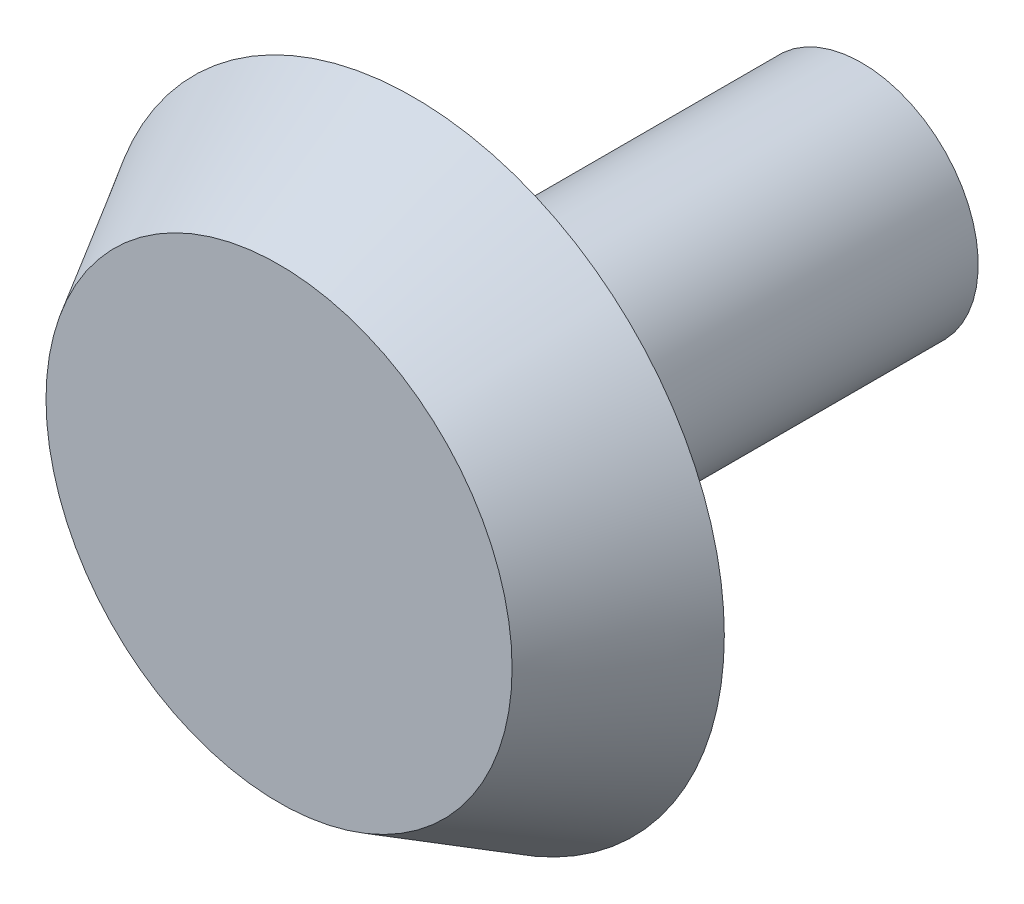
ISO-10303-21;
HEADER;
FILE_DESCRIPTION(('STEP AP214'),'2;1');
FILE_NAME('part.step','',(''),(''),'','','');
FILE_SCHEMA(('AUTOMOTIVE_DESIGN { 1 0 10303 214 1 1 1 1 }'));
ENDSEC;
DATA;
#1=APPLICATION_CONTEXT('core data for automotive mechanical design processes');
#2=APPLICATION_PROTOCOL_DEFINITION('international standard','automotive_design',2000,#1);
#3=PRODUCT_CONTEXT('',#1,'mechanical');
#4=PRODUCT('Part','Part','',(#3));
#5=PRODUCT_RELATED_PRODUCT_CATEGORY('part','',(#4));
#6=PRODUCT_DEFINITION_FORMATION('','',#4);
#7=PRODUCT_DEFINITION_CONTEXT('part definition',#1,'design');
#8=PRODUCT_DEFINITION('design','',#6,#7);
#9=PRODUCT_DEFINITION_SHAPE('','',#8);
#10=(LENGTH_UNIT() NAMED_UNIT(*) SI_UNIT(.MILLI.,.METRE.));
#11=(NAMED_UNIT(*) PLANE_ANGLE_UNIT() SI_UNIT($,.RADIAN.));
#12=(NAMED_UNIT(*) SI_UNIT($,.STERADIAN.) SOLID_ANGLE_UNIT());
#13=UNCERTAINTY_MEASURE_WITH_UNIT(LENGTH_MEASURE(1.E-05),#10,'distance_accuracy_value','');
#14=(GEOMETRIC_REPRESENTATION_CONTEXT(3) GLOBAL_UNCERTAINTY_ASSIGNED_CONTEXT((#13)) GLOBAL_UNIT_ASSIGNED_CONTEXT((#10,
#11,#12)) REPRESENTATION_CONTEXT('',''));
#15=CARTESIAN_POINT('',(0.,0.,0.));
#16=DIRECTION('',(0.,0.,1.));
#17=DIRECTION('',(1.,0.,0.));
#18=AXIS2_PLACEMENT_3D('',#15,#16,#17);
#19=CARTESIAN_POINT('',(0.,0.,-75.));
#20=DIRECTION('',(0.,0.,1.));
#21=DIRECTION('',(1.,0.,0.));
#22=AXIS2_PLACEMENT_3D('',#19,#20,#21);
#23=PLANE('',#22);
#24=CARTESIAN_POINT('',(0.,0.,-75.));
#25=DIRECTION('',(0.,0.,-1.));
#26=DIRECTION('',(-1.,0.,0.));
#27=AXIS2_PLACEMENT_3D('',#24,#25,#26);
#28=CIRCLE('',#27,15.);
#29=CARTESIAN_POINT('',(-15.,0.,-75.));
#30=VERTEX_POINT('',#29);
#31=EDGE_CURVE('E10',#30,#30,#28,.T.);
#32=ORIENTED_EDGE('',*,*,#31,.T.);
#33=EDGE_LOOP('',(#32));
#34=FACE_BOUND('',#33,.T.);
#35=ADVANCED_FACE('F37',(#34),#23,.F.);
#36=CARTESIAN_POINT('',(0.,0.,-75.));
#37=DIRECTION('',(0.,0.,-1.));
#38=DIRECTION('',(-1.,0.,0.));
#39=AXIS2_PLACEMENT_3D('',#36,#37,#38);
#40=CYLINDRICAL_SURFACE('',#39,15.);
#41=ORIENTED_EDGE('',*,*,#31,.F.);
#42=EDGE_LOOP('',(#41));
#43=FACE_BOUND('',#42,.T.);
#44=CARTESIAN_POINT('',(0.,0.,-9.99999999999999));
#45=DIRECTION('',(0.,0.,-1.));
#46=DIRECTION('',(-1.,0.,0.));
#47=AXIS2_PLACEMENT_3D('',#44,#45,#46);
#48=CIRCLE('',#47,15.);
#49=CARTESIAN_POINT('',(-15.,0.,-9.99999999999999));
#50=VERTEX_POINT('',#49);
#51=EDGE_CURVE('E44',#50,#50,#48,.T.);
#52=ORIENTED_EDGE('',*,*,#51,.T.);
#53=EDGE_LOOP('',(#52));
#54=FACE_BOUND('',#53,.T.);
#55=ADVANCED_FACE('F77',(#43,#54),#40,.T.);
#56=CARTESIAN_POINT('',(15.,0.,-10.));
#57=DIRECTION('',(0.,0.,1.));
#58=DIRECTION('',(1.,0.,0.));
#59=AXIS2_PLACEMENT_3D('',#56,#57,#58);
#60=PLANE('',#59);
#61=ORIENTED_EDGE('',*,*,#51,.F.);
#62=EDGE_LOOP('',(#61));
#63=FACE_BOUND('',#62,.T.);
#64=CARTESIAN_POINT('',(0.,0.,-9.99999999999999));
#65=DIRECTION('',(0.,0.,-1.));
#66=DIRECTION('',(-1.,0.,0.));
#67=AXIS2_PLACEMENT_3D('',#64,#65,#66);
#68=CIRCLE('',#67,30.);
#69=CARTESIAN_POINT('',(-30.,0.,-9.99999999999999));
#70=VERTEX_POINT('',#69);
#71=EDGE_CURVE('E49',#70,#70,#68,.T.);
#72=ORIENTED_EDGE('',*,*,#71,.T.);
#73=EDGE_LOOP('',(#72));
#74=FACE_BOUND('',#73,.T.);
#75=ADVANCED_FACE('F81',(#63,#74),#60,.F.);
#76=CARTESIAN_POINT('',(0.,0.,-17.3205080756886));
#77=DIRECTION('',(0.,0.,-1.));
#78=DIRECTION('',(-1.,0.,0.));
#79=AXIS2_PLACEMENT_3D('',#76,#77,#78);
#80=CONICAL_SURFACE('',#79,40.,0.938882014419837);
#81=ORIENTED_EDGE('',*,*,#71,.F.);
#82=EDGE_LOOP('',(#81));
#83=FACE_BOUND('',#82,.T.);
#84=CARTESIAN_POINT('',(0.,0.,-17.3205080756886));
#85=DIRECTION('',(0.,0.,-1.));
#86=DIRECTION('',(-1.,0.,0.));
#87=AXIS2_PLACEMENT_3D('',#84,#85,#86);
#88=CIRCLE('',#87,40.);
#89=CARTESIAN_POINT('',(-40.,0.,-17.3205080756886));
#90=VERTEX_POINT('',#89);
#91=EDGE_CURVE('E54',#90,#90,#88,.T.);
#92=ORIENTED_EDGE('',*,*,#91,.T.);
#93=EDGE_LOOP('',(#92));
#94=FACE_BOUND('',#93,.T.);
#95=ADVANCED_FACE('F73',(#83,#94),#80,.F.);
#96=CARTESIAN_POINT('',(0.,0.,0.));
#97=DIRECTION('',(0.,0.,-1.));
#98=DIRECTION('',(-1.,0.,0.));
#99=AXIS2_PLACEMENT_3D('',#96,#97,#98);
#100=CONICAL_SURFACE('',#99,30.,0.523598775598304);
#101=ORIENTED_EDGE('',*,*,#91,.F.);
#102=EDGE_LOOP('',(#101));
#103=FACE_BOUND('',#102,.T.);
#104=CARTESIAN_POINT('',(0.,0.,0.));
#105=DIRECTION('',(0.,0.,-1.));
#106=DIRECTION('',(-1.,0.,0.));
#107=AXIS2_PLACEMENT_3D('',#104,#105,#106);
#108=CIRCLE('',#107,30.);
#109=CARTESIAN_POINT('',(-30.,0.,0.));
#110=VERTEX_POINT('',#109);
#111=EDGE_CURVE('E60',#110,#110,#108,.T.);
#112=ORIENTED_EDGE('',*,*,#111,.T.);
#113=EDGE_LOOP('',(#112));
#114=FACE_BOUND('',#113,.T.);
#115=ADVANCED_FACE('F65',(#103,#114),#100,.T.);
#116=CARTESIAN_POINT('',(30.,0.,0.));
#117=DIRECTION('',(0.,0.,-1.));
#118=DIRECTION('',(-1.,0.,0.));
#119=AXIS2_PLACEMENT_3D('',#116,#117,#118);
#120=PLANE('',#119);
#121=ORIENTED_EDGE('',*,*,#111,.F.);
#122=EDGE_LOOP('',(#121));
#123=FACE_BOUND('',#122,.T.);
#124=ADVANCED_FACE('F67',(#123),#120,.F.);
#125=CLOSED_SHELL('',(#35,#55,#75,#95,#115,#124));
#126=MANIFOLD_SOLID_BREP('B2',#125);
#127=ADVANCED_BREP_SHAPE_REPRESENTATION('',(#18,#126),#14);
#128=SHAPE_DEFINITION_REPRESENTATION(#9,#127);
ENDSEC;
END-ISO-10303-21;
